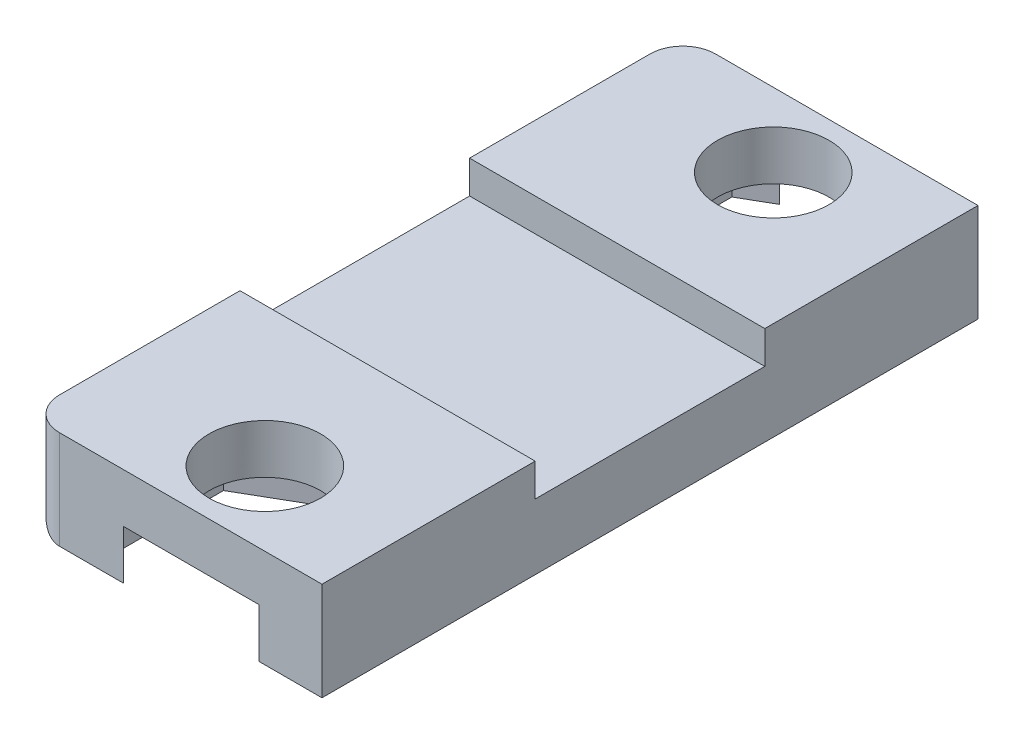
ISO-10303-21;
HEADER;
FILE_DESCRIPTION(('STEP AP214'),'2;1');
FILE_NAME('part.step','',(''),(''),'','','');
FILE_SCHEMA(('AUTOMOTIVE_DESIGN { 1 0 10303 214 1 1 1 1 }'));
ENDSEC;
DATA;
#1=APPLICATION_CONTEXT('core data for automotive mechanical design processes');
#2=APPLICATION_PROTOCOL_DEFINITION('international standard','automotive_design',2000,#1);
#3=PRODUCT_CONTEXT('',#1,'mechanical');
#4=PRODUCT('Part','Part','',(#3));
#5=PRODUCT_RELATED_PRODUCT_CATEGORY('part','',(#4));
#6=PRODUCT_DEFINITION_FORMATION('','',#4);
#7=PRODUCT_DEFINITION_CONTEXT('part definition',#1,'design');
#8=PRODUCT_DEFINITION('design','',#6,#7);
#9=PRODUCT_DEFINITION_SHAPE('','',#8);
#10=(LENGTH_UNIT() NAMED_UNIT(*) SI_UNIT(.MILLI.,.METRE.));
#11=(NAMED_UNIT(*) PLANE_ANGLE_UNIT() SI_UNIT($,.RADIAN.));
#12=(NAMED_UNIT(*) SI_UNIT($,.STERADIAN.) SOLID_ANGLE_UNIT());
#13=UNCERTAINTY_MEASURE_WITH_UNIT(LENGTH_MEASURE(1.E-05),#10,'distance_accuracy_value','');
#14=(GEOMETRIC_REPRESENTATION_CONTEXT(3) GLOBAL_UNCERTAINTY_ASSIGNED_CONTEXT((#13)) GLOBAL_UNIT_ASSIGNED_CONTEXT((#10,
#11,#12)) REPRESENTATION_CONTEXT('',''));
#15=CARTESIAN_POINT('',(0.,0.,0.));
#16=DIRECTION('',(0.,0.,1.));
#17=DIRECTION('',(1.,0.,0.));
#18=AXIS2_PLACEMENT_3D('',#15,#16,#17);
#19=CARTESIAN_POINT('',(0.,0.,0.));
#20=DIRECTION('',(0.,1.,0.));
#21=DIRECTION('',(0.,0.,1.));
#22=AXIS2_PLACEMENT_3D('',#19,#20,#21);
#23=PLANE('',#22);
#24=DIRECTION('',(0.,0.,1.));
#25=VECTOR('',#24,1.);
#26=CARTESIAN_POINT('',(160.954426616135,0.,2.));
#27=LINE('',#26,#25);
#28=CARTESIAN_POINT('',(160.954426616135,0.,15.5));
#29=VERTEX_POINT('',#28);
#30=CARTESIAN_POINT('',(160.954426616135,0.,21.));
#31=VERTEX_POINT('',#30);
#32=EDGE_CURVE('E387',#29,#31,#27,.T.);
#33=ORIENTED_EDGE('',*,*,#32,.T.);
#34=CARTESIAN_POINT('',(161.954426616135,0.,21.));
#35=DIRECTION('',(0.,1.,0.));
#36=DIRECTION('',(0.,0.,1.));
#37=AXIS2_PLACEMENT_3D('',#34,#35,#36);
#38=CIRCLE('',#37,1.);
#39=CARTESIAN_POINT('',(161.954426616135,0.,22.));
#40=VERTEX_POINT('',#39);
#41=EDGE_CURVE('E44',#31,#40,#38,.T.);
#42=ORIENTED_EDGE('',*,*,#41,.T.);
#43=DIRECTION('',(1.,0.,0.));
#44=VECTOR('',#43,1.);
#45=CARTESIAN_POINT('',(160.954426616135,0.,22.));
#46=LINE('',#45,#44);
#47=CARTESIAN_POINT('',(169.954426616135,0.,22.));
#48=VERTEX_POINT('',#47);
#49=EDGE_CURVE('E220',#40,#48,#46,.T.);
#50=ORIENTED_EDGE('',*,*,#49,.T.);
#51=DIRECTION('',(0.,0.,-1.));
#52=VECTOR('',#51,1.);
#53=CARTESIAN_POINT('',(169.954426616135,0.,2.));
#54=LINE('',#53,#52);
#55=CARTESIAN_POINT('',(169.954426616135,0.,15.5));
#56=VERTEX_POINT('',#55);
#57=EDGE_CURVE('E215',#48,#56,#54,.T.);
#58=ORIENTED_EDGE('',*,*,#57,.T.);
#59=DIRECTION('',(-1.,0.,0.));
#60=VECTOR('',#59,1.);
#61=CARTESIAN_POINT('',(169.955426616135,0.,15.5));
#62=LINE('',#61,#60);
#63=EDGE_CURVE('E198',#56,#29,#62,.T.);
#64=ORIENTED_EDGE('',*,*,#63,.T.);
#65=EDGE_LOOP('',(#33,#42,#50,#58,#64));
#66=FACE_BOUND('',#65,.T.);
#67=CARTESIAN_POINT('',(165.962302832178,0.,19.75));
#68=DIRECTION('',(0.,1.,0.));
#69=DIRECTION('',(0.,0.,1.));
#70=AXIS2_PLACEMENT_3D('',#67,#68,#69);
#71=CIRCLE('',#70,1.70000000000001);
#72=CARTESIAN_POINT('',(165.962302832178,0.,21.45));
#73=VERTEX_POINT('',#72);
#74=EDGE_CURVE('E381',#73,#73,#71,.T.);
#75=ORIENTED_EDGE('',*,*,#74,.F.);
#76=EDGE_LOOP('',(#75));
#77=FACE_BOUND('',#76,.T.);
#78=ADVANCED_FACE('F35',(#66,#77),#23,.T.);
#79=CARTESIAN_POINT('',(165.962302832178,-3.,19.75));
#80=DIRECTION('',(0.,1.,0.));
#81=DIRECTION('',(0.,0.,1.));
#82=AXIS2_PLACEMENT_3D('',#79,#80,#81);
#83=CYLINDRICAL_SURFACE('',#82,1.70000000000001);
#84=ORIENTED_EDGE('',*,*,#74,.T.);
#85=EDGE_LOOP('',(#84));
#86=FACE_BOUND('',#85,.T.);
#87=CARTESIAN_POINT('',(165.962302832178,-1.5,19.75));
#88=DIRECTION('',(0.,-1.,0.));
#89=DIRECTION('',(0.,0.,-1.));
#90=AXIS2_PLACEMENT_3D('',#87,#88,#89);
#91=CIRCLE('',#90,1.70000000000001);
#92=CARTESIAN_POINT('',(165.962302832178,-1.5,18.05));
#93=VERTEX_POINT('',#92);
#94=EDGE_CURVE('E237',#93,#93,#91,.F.);
#95=ORIENTED_EDGE('',*,*,#94,.F.);
#96=EDGE_LOOP('',(#95));
#97=FACE_BOUND('',#96,.T.);
#98=ADVANCED_FACE('F420',(#86,#97),#83,.F.);
#99=CARTESIAN_POINT('',(160.954426616135,-3.,2.));
#100=DIRECTION('',(-1.,0.,0.));
#101=DIRECTION('',(0.,0.,1.));
#102=AXIS2_PLACEMENT_3D('',#99,#100,#101);
#103=PLANE('',#102);
#104=CARTESIAN_POINT('',(160.954426616135,0.,3.));
#105=VERTEX_POINT('',#104);
#106=CARTESIAN_POINT('',(160.954426616135,0.,8.5));
#107=VERTEX_POINT('',#106);
#108=EDGE_CURVE('E395',#105,#107,#27,.T.);
#109=ORIENTED_EDGE('',*,*,#108,.F.);
#110=DIRECTION('',(0.,1.,0.));
#111=VECTOR('',#110,1.);
#112=CARTESIAN_POINT('',(160.954426616135,-3.,3.));
#113=LINE('',#112,#111);
#114=CARTESIAN_POINT('',(160.954426616135,-2.,3.));
#115=VERTEX_POINT('',#114);
#116=EDGE_CURVE('E251',#105,#115,#113,.F.);
#117=ORIENTED_EDGE('',*,*,#116,.T.);
#118=DIRECTION('',(0.,0.,1.));
#119=VECTOR('',#118,1.);
#120=CARTESIAN_POINT('',(160.954426616135,-2.,22.));
#121=LINE('',#120,#119);
#122=CARTESIAN_POINT('',(160.954426616135,-2.,21.));
#123=VERTEX_POINT('',#122);
#124=EDGE_CURVE('E248',#115,#123,#121,.T.);
#125=ORIENTED_EDGE('',*,*,#124,.T.);
#126=DIRECTION('',(0.,1.,0.));
#127=VECTOR('',#126,1.);
#128=CARTESIAN_POINT('',(160.954426616135,-3.,21.));
#129=LINE('',#128,#127);
#130=EDGE_CURVE('E233',#123,#31,#129,.T.);
#131=ORIENTED_EDGE('',*,*,#130,.T.);
#132=ORIENTED_EDGE('',*,*,#32,.F.);
#133=DIRECTION('',(0.,1.,0.));
#134=VECTOR('',#133,1.);
#135=CARTESIAN_POINT('',(160.954426616135,-1.,15.5));
#136=LINE('',#135,#134);
#137=CARTESIAN_POINT('',(160.954426616135,-1.,15.5));
#138=VERTEX_POINT('',#137);
#139=EDGE_CURVE('E204',#138,#29,#136,.T.);
#140=ORIENTED_EDGE('',*,*,#139,.F.);
#141=DIRECTION('',(0.,0.,1.));
#142=VECTOR('',#141,1.);
#143=CARTESIAN_POINT('',(160.954426616135,-1.,8.5));
#144=LINE('',#143,#142);
#145=CARTESIAN_POINT('',(160.954426616135,-1.,8.5));
#146=VERTEX_POINT('',#145);
#147=EDGE_CURVE('E208',#146,#138,#144,.T.);
#148=ORIENTED_EDGE('',*,*,#147,.F.);
#149=DIRECTION('',(0.,-1.,0.));
#150=VECTOR('',#149,1.);
#151=CARTESIAN_POINT('',(160.954426616135,-1.,8.5));
#152=LINE('',#151,#150);
#153=EDGE_CURVE('E272',#107,#146,#152,.T.);
#154=ORIENTED_EDGE('',*,*,#153,.F.);
#155=EDGE_LOOP('',(#109,#117,#125,#131,#132,#140,#148,#154));
#156=FACE_BOUND('',#155,.T.);
#157=ADVANCED_FACE('F428',(#156),#103,.T.);
#158=CARTESIAN_POINT('',(160.954426616135,-3.,2.));
#159=DIRECTION('',(0.,0.,-1.));
#160=DIRECTION('',(-1.,0.,0.));
#161=AXIS2_PLACEMENT_3D('',#158,#159,#160);
#162=PLANE('',#161);
#163=DIRECTION('',(-1.,0.,0.));
#164=VECTOR('',#163,1.);
#165=CARTESIAN_POINT('',(160.954426616135,-3.,2.));
#166=LINE('',#165,#164);
#167=CARTESIAN_POINT('',(163.896382905633,-3.,2.));
#168=VERTEX_POINT('',#167);
#169=CARTESIAN_POINT('',(161.954426616135,-3.,2.));
#170=VERTEX_POINT('',#169);
#171=EDGE_CURVE('E393',#168,#170,#166,.T.);
#172=ORIENTED_EDGE('',*,*,#171,.T.);
#173=DIRECTION('',(0.,1.,0.));
#174=VECTOR('',#173,1.);
#175=CARTESIAN_POINT('',(161.954426616135,-3.,2.));
#176=LINE('',#175,#174);
#177=CARTESIAN_POINT('',(161.954426616135,0.,2.));
#178=VERTEX_POINT('',#177);
#179=EDGE_CURVE('E59',#170,#178,#176,.T.);
#180=ORIENTED_EDGE('',*,*,#179,.T.);
#181=DIRECTION('',(-1.,0.,0.));
#182=VECTOR('',#181,1.);
#183=CARTESIAN_POINT('',(160.954426616135,0.,2.));
#184=LINE('',#183,#182);
#185=CARTESIAN_POINT('',(169.954426616135,0.,2.));
#186=VERTEX_POINT('',#185);
#187=EDGE_CURVE('E222',#186,#178,#184,.T.);
#188=ORIENTED_EDGE('',*,*,#187,.F.);
#189=DIRECTION('',(0.,1.,0.));
#190=VECTOR('',#189,1.);
#191=CARTESIAN_POINT('',(169.954426616135,-3.,2.));
#192=LINE('',#191,#190);
#193=CARTESIAN_POINT('',(169.954426616135,-3.,2.));
#194=VERTEX_POINT('',#193);
#195=EDGE_CURVE('E230',#194,#186,#192,.T.);
#196=ORIENTED_EDGE('',*,*,#195,.F.);
#197=CARTESIAN_POINT('',(168.028222758723,-3.,2.00000000000001));
#198=VERTEX_POINT('',#197);
#199=EDGE_CURVE('E236',#194,#198,#166,.T.);
#200=ORIENTED_EDGE('',*,*,#199,.T.);
#201=DIRECTION('',(0.,-1.,0.));
#202=VECTOR('',#201,1.);
#203=CARTESIAN_POINT('',(168.028222758723,-3.,2.));
#204=LINE('',#203,#202);
#205=CARTESIAN_POINT('',(168.028222758723,-1.5,2.));
#206=VERTEX_POINT('',#205);
#207=EDGE_CURVE('E329',#206,#198,#204,.T.);
#208=ORIENTED_EDGE('',*,*,#207,.F.);
#209=DIRECTION('',(1.,0.,0.));
#210=VECTOR('',#209,1.);
#211=CARTESIAN_POINT('',(160.954426616135,-1.5,2.));
#212=LINE('',#211,#210);
#213=CARTESIAN_POINT('',(163.896382905633,-1.5,2.));
#214=VERTEX_POINT('',#213);
#215=EDGE_CURVE('E245',#214,#206,#212,.T.);
#216=ORIENTED_EDGE('',*,*,#215,.F.);
#217=DIRECTION('',(0.,1.,0.));
#218=VECTOR('',#217,1.);
#219=CARTESIAN_POINT('',(163.896382905633,-3.,2.));
#220=LINE('',#219,#218);
#221=EDGE_CURVE('E327',#168,#214,#220,.T.);
#222=ORIENTED_EDGE('',*,*,#221,.F.);
#223=EDGE_LOOP('',(#172,#180,#188,#196,#200,#208,#216,#222));
#224=FACE_BOUND('',#223,.T.);
#225=ADVANCED_FACE('F456',(#224),#162,.T.);
#226=CARTESIAN_POINT('',(169.954426616135,-3.,2.));
#227=DIRECTION('',(1.,0.,0.));
#228=DIRECTION('',(0.,0.,-1.));
#229=AXIS2_PLACEMENT_3D('',#226,#227,#228);
#230=PLANE('',#229);
#231=DIRECTION('',(0.,1.,0.));
#232=VECTOR('',#231,1.);
#233=CARTESIAN_POINT('',(169.954426616135,-1.,15.5));
#234=LINE('',#233,#232);
#235=CARTESIAN_POINT('',(169.954426616135,-1.,15.5));
#236=VERTEX_POINT('',#235);
#237=EDGE_CURVE('E201',#236,#56,#234,.T.);
#238=ORIENTED_EDGE('',*,*,#237,.T.);
#239=ORIENTED_EDGE('',*,*,#57,.F.);
#240=DIRECTION('',(0.,1.,0.));
#241=VECTOR('',#240,1.);
#242=CARTESIAN_POINT('',(169.954426616135,-3.,22.));
#243=LINE('',#242,#241);
#244=CARTESIAN_POINT('',(169.954426616135,-3.,22.));
#245=VERTEX_POINT('',#244);
#246=EDGE_CURVE('E234',#245,#48,#243,.T.);
#247=ORIENTED_EDGE('',*,*,#246,.F.);
#248=DIRECTION('',(0.,0.,-1.));
#249=VECTOR('',#248,1.);
#250=CARTESIAN_POINT('',(169.954426616135,-3.,2.));
#251=LINE('',#250,#249);
#252=EDGE_CURVE('E390',#245,#194,#251,.T.);
#253=ORIENTED_EDGE('',*,*,#252,.T.);
#254=ORIENTED_EDGE('',*,*,#195,.T.);
#255=CARTESIAN_POINT('',(169.954426616135,0.,8.5));
#256=VERTEX_POINT('',#255);
#257=EDGE_CURVE('E223',#256,#186,#54,.T.);
#258=ORIENTED_EDGE('',*,*,#257,.F.);
#259=DIRECTION('',(0.,-1.,0.));
#260=VECTOR('',#259,1.);
#261=CARTESIAN_POINT('',(169.954426616135,-1.,8.5));
#262=LINE('',#261,#260);
#263=CARTESIAN_POINT('',(169.954426616135,-1.,8.5));
#264=VERTEX_POINT('',#263);
#265=EDGE_CURVE('E265',#256,#264,#262,.T.);
#266=ORIENTED_EDGE('',*,*,#265,.T.);
#267=DIRECTION('',(0.,0.,1.));
#268=VECTOR('',#267,1.);
#269=CARTESIAN_POINT('',(169.954426616135,-1.,8.5));
#270=LINE('',#269,#268);
#271=EDGE_CURVE('E217',#264,#236,#270,.T.);
#272=ORIENTED_EDGE('',*,*,#271,.T.);
#273=EDGE_LOOP('',(#238,#239,#247,#253,#254,#258,#266,#272));
#274=FACE_BOUND('',#273,.T.);
#275=ADVANCED_FACE('F213',(#274),#230,.T.);
#276=CARTESIAN_POINT('',(160.954426616135,-3.,22.));
#277=DIRECTION('',(0.,0.,1.));
#278=DIRECTION('',(1.,0.,0.));
#279=AXIS2_PLACEMENT_3D('',#276,#277,#278);
#280=PLANE('',#279);
#281=ORIENTED_EDGE('',*,*,#49,.F.);
#282=DIRECTION('',(0.,1.,0.));
#283=VECTOR('',#282,1.);
#284=CARTESIAN_POINT('',(161.954426616135,-3.,22.));
#285=LINE('',#284,#283);
#286=CARTESIAN_POINT('',(161.954426616135,-3.,22.));
#287=VERTEX_POINT('',#286);
#288=EDGE_CURVE('E11',#40,#287,#285,.F.);
#289=ORIENTED_EDGE('',*,*,#288,.T.);
#290=DIRECTION('',(1.,0.,0.));
#291=VECTOR('',#290,1.);
#292=CARTESIAN_POINT('',(160.954426616135,-3.,22.));
#293=LINE('',#292,#291);
#294=CARTESIAN_POINT('',(163.896382905633,-3.,22.));
#295=VERTEX_POINT('',#294);
#296=EDGE_CURVE('E388',#287,#295,#293,.T.);
#297=ORIENTED_EDGE('',*,*,#296,.T.);
#298=DIRECTION('',(0.,-1.,0.));
#299=VECTOR('',#298,1.);
#300=CARTESIAN_POINT('',(163.896382905633,-3.,22.));
#301=LINE('',#300,#299);
#302=CARTESIAN_POINT('',(163.896382905633,-1.5,22.));
#303=VERTEX_POINT('',#302);
#304=EDGE_CURVE('E378',#303,#295,#301,.T.);
#305=ORIENTED_EDGE('',*,*,#304,.F.);
#306=DIRECTION('',(1.,0.,0.));
#307=VECTOR('',#306,1.);
#308=CARTESIAN_POINT('',(160.954426616135,-1.5,22.));
#309=LINE('',#308,#307);
#310=CARTESIAN_POINT('',(168.028222758723,-1.5,22.));
#311=VERTEX_POINT('',#310);
#312=EDGE_CURVE('E240',#303,#311,#309,.T.);
#313=ORIENTED_EDGE('',*,*,#312,.T.);
#314=DIRECTION('',(0.,1.,0.));
#315=VECTOR('',#314,1.);
#316=CARTESIAN_POINT('',(168.028222758723,-3.,22.));
#317=LINE('',#316,#315);
#318=CARTESIAN_POINT('',(168.028222758723,-3.,22.));
#319=VERTEX_POINT('',#318);
#320=EDGE_CURVE('E376',#319,#311,#317,.T.);
#321=ORIENTED_EDGE('',*,*,#320,.F.);
#322=EDGE_CURVE('E225',#319,#245,#293,.T.);
#323=ORIENTED_EDGE('',*,*,#322,.T.);
#324=ORIENTED_EDGE('',*,*,#246,.T.);
#325=EDGE_LOOP('',(#281,#289,#297,#305,#313,#321,#323,#324));
#326=FACE_BOUND('',#325,.T.);
#327=ADVANCED_FACE('F405',(#326),#280,.T.);
#328=CARTESIAN_POINT('',(0.,-3.,0.));
#329=DIRECTION('',(0.,1.,0.));
#330=DIRECTION('',(0.,0.,1.));
#331=AXIS2_PLACEMENT_3D('',#328,#329,#330);
#332=PLANE('',#331);
#333=ORIENTED_EDGE('',*,*,#296,.F.);
#334=DIRECTION('',(0.,0.,1.));
#335=VECTOR('',#334,1.);
#336=CARTESIAN_POINT('',(161.954426616135,-3.,2.));
#337=LINE('',#336,#335);
#338=EDGE_CURVE('E253',#287,#170,#337,.F.);
#339=ORIENTED_EDGE('',*,*,#338,.T.);
#340=ORIENTED_EDGE('',*,*,#171,.F.);
#341=DIRECTION('',(0.86602540378444,0.,-0.499999999999998));
#342=VECTOR('',#341,1.);
#343=CARTESIAN_POINT('',(165.962302832178,-3.,0.80724057428494));
#344=LINE('',#343,#342);
#345=CARTESIAN_POINT('',(162.98078571039,-3.,2.52862028714248));
#346=VERTEX_POINT('',#345);
#347=EDGE_CURVE('E310',#346,#168,#344,.T.);
#348=ORIENTED_EDGE('',*,*,#347,.F.);
#349=DIRECTION('',(0.,0.,-1.));
#350=VECTOR('',#349,1.);
#351=CARTESIAN_POINT('',(162.98078571039,-3.,2.52862028714248));
#352=LINE('',#351,#350);
#353=CARTESIAN_POINT('',(162.98078571039,-3.,5.97137971285751));
#354=VERTEX_POINT('',#353);
#355=EDGE_CURVE('E307',#354,#346,#352,.T.);
#356=ORIENTED_EDGE('',*,*,#355,.F.);
#357=DIRECTION('',(-0.866025403784439,0.,-0.5));
#358=VECTOR('',#357,1.);
#359=CARTESIAN_POINT('',(162.98078571039,-3.,5.97137971285751));
#360=LINE('',#359,#358);
#361=CARTESIAN_POINT('',(165.962302832178,-3.,7.69275942571507));
#362=VERTEX_POINT('',#361);
#363=EDGE_CURVE('E304',#362,#354,#360,.T.);
#364=ORIENTED_EDGE('',*,*,#363,.F.);
#365=DIRECTION('',(-0.866025403784439,0.,0.5));
#366=VECTOR('',#365,1.);
#367=CARTESIAN_POINT('',(165.962302832178,-3.,7.69275942571506));
#368=LINE('',#367,#366);
#369=CARTESIAN_POINT('',(168.943819953965,-3.,5.97137971285753));
#370=VERTEX_POINT('',#369);
#371=EDGE_CURVE('E279',#370,#362,#368,.T.);
#372=ORIENTED_EDGE('',*,*,#371,.F.);
#373=DIRECTION('',(0.,0.,1.));
#374=VECTOR('',#373,1.);
#375=CARTESIAN_POINT('',(168.943819953965,-3.,5.97137971285753));
#376=LINE('',#375,#374);
#377=CARTESIAN_POINT('',(168.943819953965,-3.,2.52862028714248));
#378=VERTEX_POINT('',#377);
#379=EDGE_CURVE('E288',#378,#370,#376,.T.);
#380=ORIENTED_EDGE('',*,*,#379,.F.);
#381=DIRECTION('',(0.866025403784438,0.,0.500000000000001));
#382=VECTOR('',#381,1.);
#383=CARTESIAN_POINT('',(168.943819953965,-3.,2.52862028714248));
#384=LINE('',#383,#382);
#385=EDGE_CURVE('E312',#198,#378,#384,.T.);
#386=ORIENTED_EDGE('',*,*,#385,.F.);
#387=ORIENTED_EDGE('',*,*,#199,.F.);
#388=ORIENTED_EDGE('',*,*,#252,.F.);
#389=ORIENTED_EDGE('',*,*,#322,.F.);
#390=DIRECTION('',(-0.866025403784438,0.,0.500000000000001));
#391=VECTOR('',#390,1.);
#392=CARTESIAN_POINT('',(168.943819953965,-3.,21.4713797128575));
#393=LINE('',#392,#391);
#394=CARTESIAN_POINT('',(168.943819953965,-3.,21.4713797128575));
#395=VERTEX_POINT('',#394);
#396=EDGE_CURVE('E352',#395,#319,#393,.T.);
#397=ORIENTED_EDGE('',*,*,#396,.F.);
#398=DIRECTION('',(0.,0.,1.));
#399=VECTOR('',#398,1.);
#400=CARTESIAN_POINT('',(168.943819953965,-3.,18.0286202871425));
#401=LINE('',#400,#399);
#402=CARTESIAN_POINT('',(168.943819953965,-3.,18.0286202871425));
#403=VERTEX_POINT('',#402);
#404=EDGE_CURVE('E331',#403,#395,#401,.T.);
#405=ORIENTED_EDGE('',*,*,#404,.F.);
#406=DIRECTION('',(0.866025403784439,0.,0.5));
#407=VECTOR('',#406,1.);
#408=CARTESIAN_POINT('',(165.962302832178,-3.,16.3072405742849));
#409=LINE('',#408,#407);
#410=CARTESIAN_POINT('',(165.962302832178,-3.,16.3072405742849));
#411=VERTEX_POINT('',#410);
#412=EDGE_CURVE('E336',#411,#403,#409,.T.);
#413=ORIENTED_EDGE('',*,*,#412,.F.);
#414=DIRECTION('',(0.866025403784439,0.,-0.5));
#415=VECTOR('',#414,1.);
#416=CARTESIAN_POINT('',(162.98078571039,-3.,18.0286202871425));
#417=LINE('',#416,#415);
#418=CARTESIAN_POINT('',(162.98078571039,-3.,18.0286202871425));
#419=VERTEX_POINT('',#418);
#420=EDGE_CURVE('E359',#419,#411,#417,.T.);
#421=ORIENTED_EDGE('',*,*,#420,.F.);
#422=DIRECTION('',(0.,0.,-1.));
#423=VECTOR('',#422,1.);
#424=CARTESIAN_POINT('',(162.98078571039,-3.,21.4713797128575));
#425=LINE('',#424,#423);
#426=CARTESIAN_POINT('',(162.98078571039,-3.,21.4713797128575));
#427=VERTEX_POINT('',#426);
#428=EDGE_CURVE('E356',#427,#419,#425,.T.);
#429=ORIENTED_EDGE('',*,*,#428,.F.);
#430=DIRECTION('',(-0.86602540378444,0.,-0.499999999999998));
#431=VECTOR('',#430,1.);
#432=CARTESIAN_POINT('',(165.962302832178,-3.,23.1927594257151));
#433=LINE('',#432,#431);
#434=EDGE_CURVE('E354',#295,#427,#433,.T.);
#435=ORIENTED_EDGE('',*,*,#434,.F.);
#436=EDGE_LOOP('',(#333,#339,#340,#348,#356,#364,#372,#380,#386,#387,#388,#389,#397,#405,#413,
#421,#429,#435));
#437=FACE_BOUND('',#436,.T.);
#438=ADVANCED_FACE('F409',(#437),#332,.F.);
#439=ORIENTED_EDGE('',*,*,#187,.T.);
#440=CARTESIAN_POINT('',(161.954426616135,0.,3.));
#441=DIRECTION('',(0.,1.,0.));
#442=DIRECTION('',(0.,0.,1.));
#443=AXIS2_PLACEMENT_3D('',#440,#441,#442);
#444=CIRCLE('',#443,1.);
#445=EDGE_CURVE('E256',#178,#105,#444,.T.);
#446=ORIENTED_EDGE('',*,*,#445,.T.);
#447=ORIENTED_EDGE('',*,*,#108,.T.);
#448=DIRECTION('',(-1.,0.,0.));
#449=VECTOR('',#448,1.);
#450=CARTESIAN_POINT('',(169.955426616135,0.,8.5));
#451=LINE('',#450,#449);
#452=EDGE_CURVE('E207',#256,#107,#451,.T.);
#453=ORIENTED_EDGE('',*,*,#452,.F.);
#454=ORIENTED_EDGE('',*,*,#257,.T.);
#455=EDGE_LOOP('',(#439,#446,#447,#453,#454));
#456=FACE_BOUND('',#455,.T.);
#457=CARTESIAN_POINT('',(165.962302832178,0.,4.24999999999999));
#458=DIRECTION('',(0.,1.,0.));
#459=DIRECTION('',(0.,0.,1.));
#460=AXIS2_PLACEMENT_3D('',#457,#458,#459);
#461=CIRCLE('',#460,1.70000000000001);
#462=CARTESIAN_POINT('',(165.962302832178,0.,5.95));
#463=VERTEX_POINT('',#462);
#464=EDGE_CURVE('E384',#463,#463,#461,.T.);
#465=ORIENTED_EDGE('',*,*,#464,.F.);
#466=EDGE_LOOP('',(#465));
#467=FACE_BOUND('',#466,.T.);
#468=ADVANCED_FACE('F422',(#456,#467),#23,.T.);
#469=CARTESIAN_POINT('',(165.962302832178,-3.,4.24999999999999));
#470=DIRECTION('',(0.,1.,0.));
#471=DIRECTION('',(0.,0.,1.));
#472=AXIS2_PLACEMENT_3D('',#469,#470,#471);
#473=CYLINDRICAL_SURFACE('',#472,1.70000000000001);
#474=CARTESIAN_POINT('',(165.962302832178,-1.5,4.24999999999999));
#475=DIRECTION('',(0.,1.,0.));
#476=DIRECTION('',(0.,0.,1.));
#477=AXIS2_PLACEMENT_3D('',#474,#475,#476);
#478=CIRCLE('',#477,1.70000000000001);
#479=CARTESIAN_POINT('',(165.962302832178,-1.5,5.95));
#480=VERTEX_POINT('',#479);
#481=EDGE_CURVE('E242',#480,#480,#478,.F.);
#482=ORIENTED_EDGE('',*,*,#481,.T.);
#483=EDGE_LOOP('',(#482));
#484=FACE_BOUND('',#483,.T.);
#485=ORIENTED_EDGE('',*,*,#464,.T.);
#486=EDGE_LOOP('',(#485));
#487=FACE_BOUND('',#486,.T.);
#488=ADVANCED_FACE('F434',(#484,#487),#473,.F.);
#489=CARTESIAN_POINT('',(0.,-1.5,0.));
#490=DIRECTION('',(0.,-1.,0.));
#491=DIRECTION('',(0.,0.,-1.));
#492=AXIS2_PLACEMENT_3D('',#489,#490,#491);
#493=PLANE('',#492);
#494=DIRECTION('',(-0.86602540378444,0.,-0.499999999999998));
#495=VECTOR('',#494,1.);
#496=CARTESIAN_POINT('',(165.962302832178,-1.5,23.1927594257151));
#497=LINE('',#496,#495);
#498=CARTESIAN_POINT('',(162.98078571039,-1.5,21.4713797128575));
#499=VERTEX_POINT('',#498);
#500=EDGE_CURVE('E339',#303,#499,#497,.T.);
#501=ORIENTED_EDGE('',*,*,#500,.T.);
#502=DIRECTION('',(0.,0.,-1.));
#503=VECTOR('',#502,1.);
#504=CARTESIAN_POINT('',(162.98078571039,-1.5,21.4713797128575));
#505=LINE('',#504,#503);
#506=CARTESIAN_POINT('',(162.98078571039,-1.5,18.0286202871425));
#507=VERTEX_POINT('',#506);
#508=EDGE_CURVE('E341',#499,#507,#505,.T.);
#509=ORIENTED_EDGE('',*,*,#508,.T.);
#510=DIRECTION('',(0.866025403784439,0.,-0.5));
#511=VECTOR('',#510,1.);
#512=CARTESIAN_POINT('',(162.98078571039,-1.5,18.0286202871425));
#513=LINE('',#512,#511);
#514=CARTESIAN_POINT('',(165.962302832178,-1.5,16.3072405742849));
#515=VERTEX_POINT('',#514);
#516=EDGE_CURVE('E344',#507,#515,#513,.T.);
#517=ORIENTED_EDGE('',*,*,#516,.T.);
#518=DIRECTION('',(0.866025403784439,0.,0.5));
#519=VECTOR('',#518,1.);
#520=CARTESIAN_POINT('',(165.962302832178,-1.5,16.3072405742849));
#521=LINE('',#520,#519);
#522=CARTESIAN_POINT('',(168.943819953965,-1.5,18.0286202871425));
#523=VERTEX_POINT('',#522);
#524=EDGE_CURVE('E347',#515,#523,#521,.T.);
#525=ORIENTED_EDGE('',*,*,#524,.T.);
#526=DIRECTION('',(0.,0.,1.));
#527=VECTOR('',#526,1.);
#528=CARTESIAN_POINT('',(168.943819953965,-1.5,18.0286202871425));
#529=LINE('',#528,#527);
#530=CARTESIAN_POINT('',(168.943819953965,-1.5,21.4713797128575));
#531=VERTEX_POINT('',#530);
#532=EDGE_CURVE('E332',#523,#531,#529,.T.);
#533=ORIENTED_EDGE('',*,*,#532,.T.);
#534=DIRECTION('',(-0.866025403784438,0.,0.500000000000001));
#535=VECTOR('',#534,1.);
#536=CARTESIAN_POINT('',(168.943819953965,-1.5,21.4713797128575));
#537=LINE('',#536,#535);
#538=EDGE_CURVE('E335',#531,#311,#537,.T.);
#539=ORIENTED_EDGE('',*,*,#538,.T.);
#540=ORIENTED_EDGE('',*,*,#312,.F.);
#541=EDGE_LOOP('',(#501,#509,#517,#525,#533,#539,#540));
#542=FACE_BOUND('',#541,.T.);
#543=ORIENTED_EDGE('',*,*,#94,.T.);
#544=EDGE_LOOP('',(#543));
#545=FACE_BOUND('',#544,.T.);
#546=ADVANCED_FACE('F440',(#542,#545),#493,.T.);
#547=CARTESIAN_POINT('',(168.943819953965,-1.5,18.0286202871425));
#548=DIRECTION('',(1.,0.,0.));
#549=DIRECTION('',(0.,0.,-1.));
#550=AXIS2_PLACEMENT_3D('',#547,#548,#549);
#551=PLANE('',#550);
#552=ORIENTED_EDGE('',*,*,#404,.T.);
#553=DIRECTION('',(0.,-1.,0.));
#554=VECTOR('',#553,1.);
#555=CARTESIAN_POINT('',(168.943819953965,-1.5,21.4713797128575));
#556=LINE('',#555,#554);
#557=EDGE_CURVE('E350',#531,#395,#556,.T.);
#558=ORIENTED_EDGE('',*,*,#557,.F.);
#559=ORIENTED_EDGE('',*,*,#532,.F.);
#560=DIRECTION('',(0.,-1.,0.));
#561=VECTOR('',#560,1.);
#562=CARTESIAN_POINT('',(168.943819953965,-1.5,18.0286202871425));
#563=LINE('',#562,#561);
#564=EDGE_CURVE('E241',#523,#403,#563,.T.);
#565=ORIENTED_EDGE('',*,*,#564,.T.);
#566=EDGE_LOOP('',(#552,#558,#559,#565));
#567=FACE_BOUND('',#566,.T.);
#568=ADVANCED_FACE('F503',(#567),#551,.F.);
#569=CARTESIAN_POINT('',(165.962302832178,-1.5,16.3072405742849));
#570=DIRECTION('',(0.5,0.,-0.866025403784438));
#571=DIRECTION('',(-0.866025403784439,0.,-0.5));
#572=AXIS2_PLACEMENT_3D('',#569,#570,#571);
#573=PLANE('',#572);
#574=ORIENTED_EDGE('',*,*,#412,.T.);
#575=ORIENTED_EDGE('',*,*,#564,.F.);
#576=ORIENTED_EDGE('',*,*,#524,.F.);
#577=DIRECTION('',(0.,-1.,0.));
#578=VECTOR('',#577,1.);
#579=CARTESIAN_POINT('',(165.962302832178,-1.5,16.3072405742849));
#580=LINE('',#579,#578);
#581=EDGE_CURVE('E365',#515,#411,#580,.T.);
#582=ORIENTED_EDGE('',*,*,#581,.T.);
#583=EDGE_LOOP('',(#574,#575,#576,#582));
#584=FACE_BOUND('',#583,.T.);
#585=ADVANCED_FACE('F505',(#584),#573,.F.);
#586=CARTESIAN_POINT('',(162.98078571039,-1.5,18.0286202871425));
#587=DIRECTION('',(-0.5,0.,-0.866025403784439));
#588=DIRECTION('',(-0.866025403784439,0.,0.5));
#589=AXIS2_PLACEMENT_3D('',#586,#587,#588);
#590=PLANE('',#589);
#591=ORIENTED_EDGE('',*,*,#420,.T.);
#592=ORIENTED_EDGE('',*,*,#581,.F.);
#593=ORIENTED_EDGE('',*,*,#516,.F.);
#594=DIRECTION('',(0.,-1.,0.));
#595=VECTOR('',#594,1.);
#596=CARTESIAN_POINT('',(162.98078571039,-1.5,18.0286202871425));
#597=LINE('',#596,#595);
#598=EDGE_CURVE('E367',#507,#419,#597,.T.);
#599=ORIENTED_EDGE('',*,*,#598,.T.);
#600=EDGE_LOOP('',(#591,#592,#593,#599));
#601=FACE_BOUND('',#600,.T.);
#602=ADVANCED_FACE('F508',(#601),#590,.F.);
#603=CARTESIAN_POINT('',(162.98078571039,-1.5,21.4713797128575));
#604=DIRECTION('',(-1.,0.,0.));
#605=DIRECTION('',(0.,0.,1.));
#606=AXIS2_PLACEMENT_3D('',#603,#604,#605);
#607=PLANE('',#606);
#608=ORIENTED_EDGE('',*,*,#428,.T.);
#609=ORIENTED_EDGE('',*,*,#598,.F.);
#610=ORIENTED_EDGE('',*,*,#508,.F.);
#611=DIRECTION('',(0.,-1.,0.));
#612=VECTOR('',#611,1.);
#613=CARTESIAN_POINT('',(162.98078571039,-1.5,21.4713797128575));
#614=LINE('',#613,#612);
#615=EDGE_CURVE('E369',#499,#427,#614,.T.);
#616=ORIENTED_EDGE('',*,*,#615,.T.);
#617=EDGE_LOOP('',(#608,#609,#610,#616));
#618=FACE_BOUND('',#617,.T.);
#619=ADVANCED_FACE('F512',(#618),#607,.F.);
#620=CARTESIAN_POINT('',(165.962302832178,-1.5,23.1927594257151));
#621=DIRECTION('',(-0.499999999999998,0.,0.86602540378444));
#622=DIRECTION('',(0.86602540378444,0.,0.499999999999998));
#623=AXIS2_PLACEMENT_3D('',#620,#621,#622);
#624=PLANE('',#623);
#625=ORIENTED_EDGE('',*,*,#304,.T.);
#626=ORIENTED_EDGE('',*,*,#434,.T.);
#627=ORIENTED_EDGE('',*,*,#615,.F.);
#628=ORIENTED_EDGE('',*,*,#500,.F.);
#629=EDGE_LOOP('',(#625,#626,#627,#628));
#630=FACE_BOUND('',#629,.T.);
#631=ADVANCED_FACE('F516',(#630),#624,.F.);
#632=CARTESIAN_POINT('',(168.943819953965,-1.5,21.4713797128575));
#633=DIRECTION('',(0.500000000000001,0.,0.866025403784438));
#634=DIRECTION('',(0.866025403784438,0.,-0.500000000000001));
#635=AXIS2_PLACEMENT_3D('',#632,#633,#634);
#636=PLANE('',#635);
#637=ORIENTED_EDGE('',*,*,#320,.T.);
#638=ORIENTED_EDGE('',*,*,#538,.F.);
#639=ORIENTED_EDGE('',*,*,#557,.T.);
#640=ORIENTED_EDGE('',*,*,#396,.T.);
#641=EDGE_LOOP('',(#637,#638,#639,#640));
#642=FACE_BOUND('',#641,.T.);
#643=ADVANCED_FACE('F496',(#642),#636,.F.);
#644=CARTESIAN_POINT('',(0.,-1.5,0.));
#645=DIRECTION('',(0.,1.,0.));
#646=DIRECTION('',(0.,0.,1.));
#647=AXIS2_PLACEMENT_3D('',#644,#645,#646);
#648=PLANE('',#647);
#649=ORIENTED_EDGE('',*,*,#215,.T.);
#650=DIRECTION('',(0.866025403784438,0.,0.500000000000001));
#651=VECTOR('',#650,1.);
#652=CARTESIAN_POINT('',(168.943819953965,-1.5,2.52862028714248));
#653=LINE('',#652,#651);
#654=CARTESIAN_POINT('',(168.943819953965,-1.5,2.52862028714248));
#655=VERTEX_POINT('',#654);
#656=EDGE_CURVE('E297',#206,#655,#653,.T.);
#657=ORIENTED_EDGE('',*,*,#656,.T.);
#658=DIRECTION('',(0.,0.,1.));
#659=VECTOR('',#658,1.);
#660=CARTESIAN_POINT('',(168.943819953965,-1.5,5.97137971285753));
#661=LINE('',#660,#659);
#662=CARTESIAN_POINT('',(168.943819953965,-1.5,5.97137971285753));
#663=VERTEX_POINT('',#662);
#664=EDGE_CURVE('E299',#655,#663,#661,.T.);
#665=ORIENTED_EDGE('',*,*,#664,.T.);
#666=DIRECTION('',(-0.866025403784439,0.,0.5));
#667=VECTOR('',#666,1.);
#668=CARTESIAN_POINT('',(165.962302832178,-1.5,7.69275942571506));
#669=LINE('',#668,#667);
#670=CARTESIAN_POINT('',(165.962302832178,-1.5,7.69275942571506));
#671=VERTEX_POINT('',#670);
#672=EDGE_CURVE('E284',#663,#671,#669,.T.);
#673=ORIENTED_EDGE('',*,*,#672,.T.);
#674=DIRECTION('',(-0.866025403784439,0.,-0.5));
#675=VECTOR('',#674,1.);
#676=CARTESIAN_POINT('',(162.98078571039,-1.5,5.97137971285751));
#677=LINE('',#676,#675);
#678=CARTESIAN_POINT('',(162.98078571039,-1.5,5.97137971285751));
#679=VERTEX_POINT('',#678);
#680=EDGE_CURVE('E287',#671,#679,#677,.T.);
#681=ORIENTED_EDGE('',*,*,#680,.T.);
#682=DIRECTION('',(0.,0.,-1.));
#683=VECTOR('',#682,1.);
#684=CARTESIAN_POINT('',(162.98078571039,-1.5,2.52862028714248));
#685=LINE('',#684,#683);
#686=CARTESIAN_POINT('',(162.98078571039,-1.5,2.52862028714248));
#687=VERTEX_POINT('',#686);
#688=EDGE_CURVE('E291',#679,#687,#685,.T.);
#689=ORIENTED_EDGE('',*,*,#688,.T.);
#690=DIRECTION('',(0.86602540378444,0.,-0.499999999999998));
#691=VECTOR('',#690,1.);
#692=CARTESIAN_POINT('',(165.962302832178,-1.5,0.80724057428494));
#693=LINE('',#692,#691);
#694=EDGE_CURVE('E294',#687,#214,#693,.T.);
#695=ORIENTED_EDGE('',*,*,#694,.T.);
#696=EDGE_LOOP('',(#649,#657,#665,#673,#681,#689,#695));
#697=FACE_BOUND('',#696,.T.);
#698=ORIENTED_EDGE('',*,*,#481,.F.);
#699=EDGE_LOOP('',(#698));
#700=FACE_BOUND('',#699,.T.);
#701=ADVANCED_FACE('F472',(#697,#700),#648,.F.);
#702=CARTESIAN_POINT('',(165.962302832178,-1.5,7.69275942571506));
#703=DIRECTION('',(0.5,0.,0.866025403784438));
#704=DIRECTION('',(0.866025403784439,0.,-0.5));
#705=AXIS2_PLACEMENT_3D('',#702,#703,#704);
#706=PLANE('',#705);
#707=ORIENTED_EDGE('',*,*,#371,.T.);
#708=DIRECTION('',(0.,-1.,0.));
#709=VECTOR('',#708,1.);
#710=CARTESIAN_POINT('',(165.962302832178,-1.5,7.69275942571506));
#711=LINE('',#710,#709);
#712=EDGE_CURVE('E302',#671,#362,#711,.T.);
#713=ORIENTED_EDGE('',*,*,#712,.F.);
#714=ORIENTED_EDGE('',*,*,#672,.F.);
#715=DIRECTION('',(0.,-1.,0.));
#716=VECTOR('',#715,1.);
#717=CARTESIAN_POINT('',(168.943819953965,-1.5,5.97137971285753));
#718=LINE('',#717,#716);
#719=EDGE_CURVE('E246',#663,#370,#718,.T.);
#720=ORIENTED_EDGE('',*,*,#719,.T.);
#721=EDGE_LOOP('',(#707,#713,#714,#720));
#722=FACE_BOUND('',#721,.T.);
#723=ADVANCED_FACE('F488',(#722),#706,.F.);
#724=CARTESIAN_POINT('',(168.943819953965,-1.5,5.97137971285753));
#725=DIRECTION('',(1.,0.,0.));
#726=DIRECTION('',(0.,0.,-1.));
#727=AXIS2_PLACEMENT_3D('',#724,#725,#726);
#728=PLANE('',#727);
#729=ORIENTED_EDGE('',*,*,#379,.T.);
#730=ORIENTED_EDGE('',*,*,#719,.F.);
#731=ORIENTED_EDGE('',*,*,#664,.F.);
#732=DIRECTION('',(0.,-1.,0.));
#733=VECTOR('',#732,1.);
#734=CARTESIAN_POINT('',(168.943819953965,-1.5,2.52862028714248));
#735=LINE('',#734,#733);
#736=EDGE_CURVE('E317',#655,#378,#735,.T.);
#737=ORIENTED_EDGE('',*,*,#736,.T.);
#738=EDGE_LOOP('',(#729,#730,#731,#737));
#739=FACE_BOUND('',#738,.T.);
#740=ADVANCED_FACE('F469',(#739),#728,.F.);
#741=CARTESIAN_POINT('',(168.943819953965,-1.5,2.52862028714248));
#742=DIRECTION('',(0.500000000000001,0.,-0.866025403784438));
#743=DIRECTION('',(-0.866025403784438,0.,-0.500000000000001));
#744=AXIS2_PLACEMENT_3D('',#741,#742,#743);
#745=PLANE('',#744);
#746=ORIENTED_EDGE('',*,*,#207,.T.);
#747=ORIENTED_EDGE('',*,*,#385,.T.);
#748=ORIENTED_EDGE('',*,*,#736,.F.);
#749=ORIENTED_EDGE('',*,*,#656,.F.);
#750=EDGE_LOOP('',(#746,#747,#748,#749));
#751=FACE_BOUND('',#750,.T.);
#752=ADVANCED_FACE('F465',(#751),#745,.F.);
#753=CARTESIAN_POINT('',(165.962302832178,-1.5,0.80724057428494));
#754=DIRECTION('',(-0.499999999999998,0.,-0.86602540378444));
#755=DIRECTION('',(-0.86602540378444,0.,0.499999999999998));
#756=AXIS2_PLACEMENT_3D('',#753,#754,#755);
#757=PLANE('',#756);
#758=ORIENTED_EDGE('',*,*,#221,.T.);
#759=ORIENTED_EDGE('',*,*,#694,.F.);
#760=DIRECTION('',(0.,-1.,0.));
#761=VECTOR('',#760,1.);
#762=CARTESIAN_POINT('',(162.98078571039,-1.5,2.52862028714248));
#763=LINE('',#762,#761);
#764=EDGE_CURVE('E320',#687,#346,#763,.T.);
#765=ORIENTED_EDGE('',*,*,#764,.T.);
#766=ORIENTED_EDGE('',*,*,#347,.T.);
#767=EDGE_LOOP('',(#758,#759,#765,#766));
#768=FACE_BOUND('',#767,.T.);
#769=ADVANCED_FACE('F480',(#768),#757,.F.);
#770=CARTESIAN_POINT('',(162.98078571039,-1.5,2.52862028714248));
#771=DIRECTION('',(-1.,0.,0.));
#772=DIRECTION('',(0.,0.,1.));
#773=AXIS2_PLACEMENT_3D('',#770,#771,#772);
#774=PLANE('',#773);
#775=ORIENTED_EDGE('',*,*,#355,.T.);
#776=ORIENTED_EDGE('',*,*,#764,.F.);
#777=ORIENTED_EDGE('',*,*,#688,.F.);
#778=DIRECTION('',(0.,-1.,0.));
#779=VECTOR('',#778,1.);
#780=CARTESIAN_POINT('',(162.98078571039,-1.5,5.97137971285751));
#781=LINE('',#780,#779);
#782=EDGE_CURVE('E322',#679,#354,#781,.T.);
#783=ORIENTED_EDGE('',*,*,#782,.T.);
#784=EDGE_LOOP('',(#775,#776,#777,#783));
#785=FACE_BOUND('',#784,.T.);
#786=ADVANCED_FACE('F483',(#785),#774,.F.);
#787=CARTESIAN_POINT('',(162.98078571039,-1.5,5.97137971285751));
#788=DIRECTION('',(-0.5,0.,0.866025403784439));
#789=DIRECTION('',(0.866025403784439,0.,0.5));
#790=AXIS2_PLACEMENT_3D('',#787,#788,#789);
#791=PLANE('',#790);
#792=ORIENTED_EDGE('',*,*,#363,.T.);
#793=ORIENTED_EDGE('',*,*,#782,.F.);
#794=ORIENTED_EDGE('',*,*,#680,.F.);
#795=ORIENTED_EDGE('',*,*,#712,.T.);
#796=EDGE_LOOP('',(#792,#793,#794,#795));
#797=FACE_BOUND('',#796,.T.);
#798=ADVANCED_FACE('F486',(#797),#791,.F.);
#799=CARTESIAN_POINT('',(169.955426616135,-1.,15.5));
#800=DIRECTION('',(0.,0.,1.));
#801=DIRECTION('',(1.,0.,0.));
#802=AXIS2_PLACEMENT_3D('',#799,#800,#801);
#803=PLANE('',#802);
#804=DIRECTION('',(-1.,0.,0.));
#805=VECTOR('',#804,1.);
#806=CARTESIAN_POINT('',(169.955426616135,-1.,15.5));
#807=LINE('',#806,#805);
#808=EDGE_CURVE('E277',#236,#138,#807,.T.);
#809=ORIENTED_EDGE('',*,*,#808,.T.);
#810=ORIENTED_EDGE('',*,*,#139,.T.);
#811=ORIENTED_EDGE('',*,*,#63,.F.);
#812=ORIENTED_EDGE('',*,*,#237,.F.);
#813=EDGE_LOOP('',(#809,#810,#811,#812));
#814=FACE_BOUND('',#813,.T.);
#815=ADVANCED_FACE('F200',(#814),#803,.F.);
#816=CARTESIAN_POINT('',(169.955426616135,-1.,8.5));
#817=DIRECTION('',(0.,-1.,0.));
#818=DIRECTION('',(0.,0.,-1.));
#819=AXIS2_PLACEMENT_3D('',#816,#817,#818);
#820=PLANE('',#819);
#821=DIRECTION('',(-1.,0.,0.));
#822=VECTOR('',#821,1.);
#823=CARTESIAN_POINT('',(169.955426616135,-1.,8.5));
#824=LINE('',#823,#822);
#825=EDGE_CURVE('E280',#264,#146,#824,.T.);
#826=ORIENTED_EDGE('',*,*,#825,.T.);
#827=ORIENTED_EDGE('',*,*,#147,.T.);
#828=ORIENTED_EDGE('',*,*,#808,.F.);
#829=ORIENTED_EDGE('',*,*,#271,.F.);
#830=EDGE_LOOP('',(#826,#827,#828,#829));
#831=FACE_BOUND('',#830,.T.);
#832=ADVANCED_FACE('F631',(#831),#820,.F.);
#833=CARTESIAN_POINT('',(169.955426616135,-1.,8.5));
#834=DIRECTION('',(0.,0.,-1.));
#835=DIRECTION('',(-1.,0.,0.));
#836=AXIS2_PLACEMENT_3D('',#833,#834,#835);
#837=PLANE('',#836);
#838=ORIENTED_EDGE('',*,*,#452,.T.);
#839=ORIENTED_EDGE('',*,*,#153,.T.);
#840=ORIENTED_EDGE('',*,*,#825,.F.);
#841=ORIENTED_EDGE('',*,*,#265,.F.);
#842=EDGE_LOOP('',(#838,#839,#840,#841));
#843=FACE_BOUND('',#842,.T.);
#844=ADVANCED_FACE('F453',(#843),#837,.F.);
#845=CARTESIAN_POINT('',(161.954426616135,-3.,3.));
#846=DIRECTION('',(0.,1.,0.));
#847=DIRECTION('',(0.,0.,1.));
#848=AXIS2_PLACEMENT_3D('',#845,#846,#847);
#849=CYLINDRICAL_SURFACE('',#848,1.);
#850=ORIENTED_EDGE('',*,*,#445,.F.);
#851=ORIENTED_EDGE('',*,*,#179,.F.);
#852=CARTESIAN_POINT('',(161.954426616135,-2.,3.));
#853=DIRECTION('',(0.,0.707106781186547,-0.707106781186547));
#854=DIRECTION('',(0.,0.707106781186547,0.707106781186547));
#855=AXIS2_PLACEMENT_3D('',#852,#853,#854);
#856=ELLIPSE('',#855,1.41421356237309,1.);
#857=EDGE_CURVE('E39',#115,#170,#856,.F.);
#858=ORIENTED_EDGE('',*,*,#857,.F.);
#859=ORIENTED_EDGE('',*,*,#116,.F.);
#860=EDGE_LOOP('',(#850,#851,#858,#859));
#861=FACE_BOUND('',#860,.T.);
#862=ADVANCED_FACE('F37',(#861),#849,.T.);
#863=CARTESIAN_POINT('',(161.954426616135,-3.,21.));
#864=DIRECTION('',(0.,1.,0.));
#865=DIRECTION('',(0.,0.,1.));
#866=AXIS2_PLACEMENT_3D('',#863,#864,#865);
#867=CYLINDRICAL_SURFACE('',#866,1.);
#868=ORIENTED_EDGE('',*,*,#41,.F.);
#869=ORIENTED_EDGE('',*,*,#130,.F.);
#870=CARTESIAN_POINT('',(161.954426616135,-2.,21.));
#871=DIRECTION('',(0.,0.707106781186547,0.707106781186547));
#872=DIRECTION('',(0.,0.707106781186547,-0.707106781186547));
#873=AXIS2_PLACEMENT_3D('',#870,#871,#872);
#874=ELLIPSE('',#873,1.41421356237309,1.);
#875=EDGE_CURVE('E258',#287,#123,#874,.F.);
#876=ORIENTED_EDGE('',*,*,#875,.F.);
#877=ORIENTED_EDGE('',*,*,#288,.F.);
#878=EDGE_LOOP('',(#868,#869,#876,#877));
#879=FACE_BOUND('',#878,.T.);
#880=ADVANCED_FACE('F402',(#879),#867,.T.);
#881=CARTESIAN_POINT('',(161.954426616135,-2.,2.));
#882=DIRECTION('',(0.,0.,-1.));
#883=DIRECTION('',(-1.,0.,0.));
#884=AXIS2_PLACEMENT_3D('',#881,#882,#883);
#885=CYLINDRICAL_SURFACE('',#884,1.);
#886=ORIENTED_EDGE('',*,*,#857,.T.);
#887=ORIENTED_EDGE('',*,*,#338,.F.);
#888=ORIENTED_EDGE('',*,*,#875,.T.);
#889=ORIENTED_EDGE('',*,*,#124,.F.);
#890=EDGE_LOOP('',(#886,#887,#888,#889));
#891=FACE_BOUND('',#890,.T.);
#892=ADVANCED_FACE('F412',(#891),#885,.T.);
#893=CLOSED_SHELL('',(#78,#98,#157,#225,#275,#327,#438,#468,#488,#546,#568,#585,#602,#619,#631,
#643,#701,#723,#740,#752,#769,#786,#798,#815,#832,#844,#862,#880,#892));
#894=MANIFOLD_SOLID_BREP('B2',#893);
#895=ADVANCED_BREP_SHAPE_REPRESENTATION('',(#18,#894),#14);
#896=SHAPE_DEFINITION_REPRESENTATION(#9,#895);
ENDSEC;
END-ISO-10303-21;
